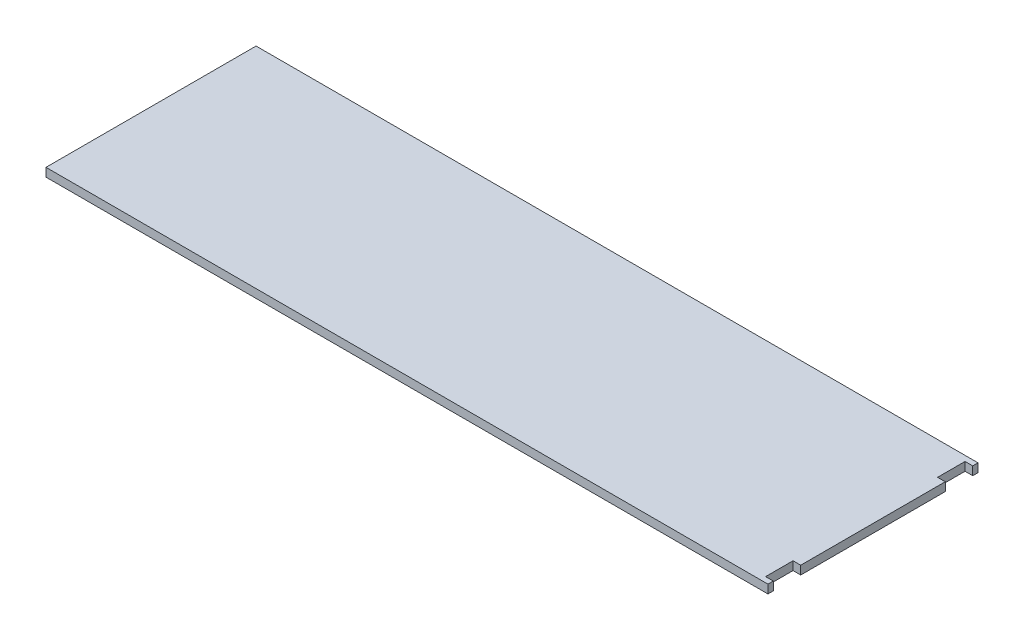
ISO-10303-21;
HEADER;
FILE_DESCRIPTION(('STEP AP214'),'2;1');
FILE_NAME('part.step','',(''),(''),'','','');
FILE_SCHEMA(('AUTOMOTIVE_DESIGN { 1 0 10303 214 1 1 1 1 }'));
ENDSEC;
DATA;
#1=APPLICATION_CONTEXT('core data for automotive mechanical design processes');
#2=APPLICATION_PROTOCOL_DEFINITION('international standard','automotive_design',2000,#1);
#3=PRODUCT_CONTEXT('',#1,'mechanical');
#4=PRODUCT('Part','Part','',(#3));
#5=PRODUCT_RELATED_PRODUCT_CATEGORY('part','',(#4));
#6=PRODUCT_DEFINITION_FORMATION('','',#4);
#7=PRODUCT_DEFINITION_CONTEXT('part definition',#1,'design');
#8=PRODUCT_DEFINITION('design','',#6,#7);
#9=PRODUCT_DEFINITION_SHAPE('','',#8);
#10=(LENGTH_UNIT() NAMED_UNIT(*) SI_UNIT(.MILLI.,.METRE.));
#11=(NAMED_UNIT(*) PLANE_ANGLE_UNIT() SI_UNIT($,.RADIAN.));
#12=(NAMED_UNIT(*) SI_UNIT($,.STERADIAN.) SOLID_ANGLE_UNIT());
#13=UNCERTAINTY_MEASURE_WITH_UNIT(LENGTH_MEASURE(1.E-05),#10,'distance_accuracy_value','');
#14=(GEOMETRIC_REPRESENTATION_CONTEXT(3) GLOBAL_UNCERTAINTY_ASSIGNED_CONTEXT((#13)) GLOBAL_UNIT_ASSIGNED_CONTEXT((#10,
#11,#12)) REPRESENTATION_CONTEXT('',''));
#15=CARTESIAN_POINT('',(0.,0.,0.));
#16=DIRECTION('',(0.,0.,1.));
#17=DIRECTION('',(1.,0.,0.));
#18=AXIS2_PLACEMENT_3D('',#15,#16,#17);
#19=CARTESIAN_POINT('',(1002.64387078607,12.7,-291.398750215943));
#20=DIRECTION('',(-1.,0.,0.));
#21=DIRECTION('',(0.,0.,1.));
#22=AXIS2_PLACEMENT_3D('',#19,#20,#21);
#23=PLANE('',#22);
#24=DIRECTION('',(0.,1.,0.));
#25=VECTOR('',#24,1.);
#26=CARTESIAN_POINT('',(1002.64387078607,0.,-27.4927502159425));
#27=LINE('',#26,#25);
#28=CARTESIAN_POINT('',(1002.64387078607,0.,-27.4927502159425));
#29=VERTEX_POINT('',#28);
#30=CARTESIAN_POINT('',(1002.64387078607,12.7,-27.4927502159425));
#31=VERTEX_POINT('',#30);
#32=EDGE_CURVE('E154',#29,#31,#27,.T.);
#33=ORIENTED_EDGE('',*,*,#32,.F.);
#34=DIRECTION('',(0.,0.,-1.));
#35=VECTOR('',#34,1.);
#36=CARTESIAN_POINT('',(1002.64387078607,0.,-291.398750215943));
#37=LINE('',#36,#35);
#38=CARTESIAN_POINT('',(1002.64387078607,0.,-242.656150215943));
#39=VERTEX_POINT('',#38);
#40=EDGE_CURVE('E203',#29,#39,#37,.T.);
#41=ORIENTED_EDGE('',*,*,#40,.T.);
#42=DIRECTION('',(0.,1.,0.));
#43=VECTOR('',#42,1.);
#44=CARTESIAN_POINT('',(1002.64387078607,0.,-242.656150215943));
#45=LINE('',#44,#43);
#46=CARTESIAN_POINT('',(1002.64387078607,12.7,-242.656150215943));
#47=VERTEX_POINT('',#46);
#48=EDGE_CURVE('E173',#39,#47,#45,.T.);
#49=ORIENTED_EDGE('',*,*,#48,.T.);
#50=DIRECTION('',(0.,0.,-1.));
#51=VECTOR('',#50,1.);
#52=CARTESIAN_POINT('',(1002.64387078607,12.7,-291.398750215943));
#53=LINE('',#52,#51);
#54=EDGE_CURVE('E193',#31,#47,#53,.T.);
#55=ORIENTED_EDGE('',*,*,#54,.F.);
#56=EDGE_LOOP('',(#33,#41,#49,#55));
#57=FACE_BOUND('',#56,.T.);
#58=ADVANCED_FACE('F33',(#57),#23,.F.);
#59=CARTESIAN_POINT('',(-72.0936292139341,12.7,21.3387497840574));
#60=DIRECTION('',(0.,1.,0.));
#61=DIRECTION('',(0.,0.,1.));
#62=AXIS2_PLACEMENT_3D('',#59,#60,#61);
#63=PLANE('',#62);
#64=DIRECTION('',(0.,0.,-1.));
#65=VECTOR('',#64,1.);
#66=CARTESIAN_POINT('',(991.213870786066,12.7,-135.030000215943));
#67=LINE('',#66,#65);
#68=CARTESIAN_POINT('',(991.213870786066,12.7,13.4012497840574));
#69=VERTEX_POINT('',#68);
#70=CARTESIAN_POINT('',(991.213870786065,12.7,-27.4927502159425));
#71=VERTEX_POINT('',#70);
#72=EDGE_CURVE('E129',#69,#71,#67,.T.);
#73=ORIENTED_EDGE('',*,*,#72,.T.);
#74=DIRECTION('',(1.,0.,0.));
#75=VECTOR('',#74,1.);
#76=CARTESIAN_POINT('',(-405.488830646532,12.7,-27.4927502159425));
#77=LINE('',#76,#75);
#78=EDGE_CURVE('E142',#71,#31,#77,.T.);
#79=ORIENTED_EDGE('',*,*,#78,.T.);
#80=ORIENTED_EDGE('',*,*,#54,.T.);
#81=DIRECTION('',(1.,0.,0.));
#82=VECTOR('',#81,1.);
#83=CARTESIAN_POINT('',(-405.488830646531,12.7,-242.65615021595));
#84=LINE('',#83,#82);
#85=CARTESIAN_POINT('',(991.213870786066,12.7,-242.656150215943));
#86=VERTEX_POINT('',#85);
#87=EDGE_CURVE('E160',#86,#47,#84,.T.);
#88=ORIENTED_EDGE('',*,*,#87,.F.);
#89=DIRECTION('',(0.,0.,1.));
#90=VECTOR('',#89,1.);
#91=CARTESIAN_POINT('',(991.213870786066,12.7,-135.030000215943));
#92=LINE('',#91,#90);
#93=CARTESIAN_POINT('',(991.213870786066,12.7,-283.550150215943));
#94=VERTEX_POINT('',#93);
#95=EDGE_CURVE('E168',#94,#86,#92,.T.);
#96=ORIENTED_EDGE('',*,*,#95,.F.);
#97=DIRECTION('',(-1.,0.,0.));
#98=VECTOR('',#97,1.);
#99=CARTESIAN_POINT('',(-405.488830646531,12.7,-283.55015021595));
#100=LINE('',#99,#98);
#101=CARTESIAN_POINT('',(1002.64387078607,12.7,-283.550150215943));
#102=VERTEX_POINT('',#101);
#103=EDGE_CURVE('E153',#102,#94,#100,.T.);
#104=ORIENTED_EDGE('',*,*,#103,.F.);
#105=CARTESIAN_POINT('',(1002.64387078607,12.7,-291.398750215943));
#106=VERTEX_POINT('',#105);
#107=EDGE_CURVE('E188',#102,#106,#53,.T.);
#108=ORIENTED_EDGE('',*,*,#107,.T.);
#109=DIRECTION('',(-1.,0.,0.));
#110=VECTOR('',#109,1.);
#111=CARTESIAN_POINT('',(-72.0936292139342,12.7,-291.398750215943));
#112=LINE('',#111,#110);
#113=CARTESIAN_POINT('',(-72.0936292139342,12.7,-291.398750215943));
#114=VERTEX_POINT('',#113);
#115=EDGE_CURVE('E192',#106,#114,#112,.T.);
#116=ORIENTED_EDGE('',*,*,#115,.T.);
#117=DIRECTION('',(0.,0.,1.));
#118=VECTOR('',#117,1.);
#119=CARTESIAN_POINT('',(-72.0936292139342,12.7,-291.398750215943));
#120=LINE('',#119,#118);
#121=CARTESIAN_POINT('',(-72.0936292139341,12.7,21.3387497840574));
#122=VERTEX_POINT('',#121);
#123=EDGE_CURVE('E182',#114,#122,#120,.T.);
#124=ORIENTED_EDGE('',*,*,#123,.T.);
#125=DIRECTION('',(1.,0.,0.));
#126=VECTOR('',#125,1.);
#127=CARTESIAN_POINT('',(-72.0936292139341,12.7,21.3387497840574));
#128=LINE('',#127,#126);
#129=CARTESIAN_POINT('',(1002.64387078607,12.7,21.3387497840574));
#130=VERTEX_POINT('',#129);
#131=EDGE_CURVE('E185',#122,#130,#128,.T.);
#132=ORIENTED_EDGE('',*,*,#131,.T.);
#133=CARTESIAN_POINT('',(1002.64387078607,12.7,13.4012497840574));
#134=VERTEX_POINT('',#133);
#135=EDGE_CURVE('E189',#130,#134,#53,.T.);
#136=ORIENTED_EDGE('',*,*,#135,.T.);
#137=DIRECTION('',(1.,0.,0.));
#138=VECTOR('',#137,1.);
#139=CARTESIAN_POINT('',(-405.488830646532,12.7,13.4012497840574));
#140=LINE('',#139,#138);
#141=EDGE_CURVE('E145',#69,#134,#140,.T.);
#142=ORIENTED_EDGE('',*,*,#141,.F.);
#143=EDGE_LOOP('',(#73,#79,#80,#88,#96,#104,#108,#116,#124,#132,#136,#142));
#144=FACE_BOUND('',#143,.T.);
#145=ADVANCED_FACE('F239',(#144),#63,.T.);
#146=CARTESIAN_POINT('',(-72.0936292139341,0.,21.3387497840574));
#147=DIRECTION('',(0.,1.,0.));
#148=DIRECTION('',(0.,0.,1.));
#149=AXIS2_PLACEMENT_3D('',#146,#147,#148);
#150=PLANE('',#149);
#151=DIRECTION('',(1.,0.,0.));
#152=VECTOR('',#151,1.);
#153=CARTESIAN_POINT('',(-405.488830646532,0.,-27.4927502159425));
#154=LINE('',#153,#152);
#155=CARTESIAN_POINT('',(991.213870786065,0.,-27.4927502159425));
#156=VERTEX_POINT('',#155);
#157=EDGE_CURVE('E131',#156,#29,#154,.T.);
#158=ORIENTED_EDGE('',*,*,#157,.F.);
#159=DIRECTION('',(0.,0.,-1.));
#160=VECTOR('',#159,1.);
#161=CARTESIAN_POINT('',(991.213870786066,0.,-135.030000215943));
#162=LINE('',#161,#160);
#163=CARTESIAN_POINT('',(991.213870786066,0.,13.4012497840574));
#164=VERTEX_POINT('',#163);
#165=EDGE_CURVE('E126',#164,#156,#162,.T.);
#166=ORIENTED_EDGE('',*,*,#165,.F.);
#167=DIRECTION('',(1.,0.,0.));
#168=VECTOR('',#167,1.);
#169=CARTESIAN_POINT('',(-405.488830646532,0.,13.4012497840574));
#170=LINE('',#169,#168);
#171=CARTESIAN_POINT('',(1002.64387078607,0.,13.4012497840573));
#172=VERTEX_POINT('',#171);
#173=EDGE_CURVE('E133',#164,#172,#170,.T.);
#174=ORIENTED_EDGE('',*,*,#173,.T.);
#175=CARTESIAN_POINT('',(1002.64387078607,0.,21.3387497840574));
#176=VERTEX_POINT('',#175);
#177=EDGE_CURVE('E201',#176,#172,#37,.T.);
#178=ORIENTED_EDGE('',*,*,#177,.F.);
#179=DIRECTION('',(1.,0.,0.));
#180=VECTOR('',#179,1.);
#181=CARTESIAN_POINT('',(-72.0936292139341,0.,21.3387497840574));
#182=LINE('',#181,#180);
#183=CARTESIAN_POINT('',(-72.0936292139341,0.,21.3387497840574));
#184=VERTEX_POINT('',#183);
#185=EDGE_CURVE('E198',#184,#176,#182,.T.);
#186=ORIENTED_EDGE('',*,*,#185,.F.);
#187=DIRECTION('',(0.,0.,1.));
#188=VECTOR('',#187,1.);
#189=CARTESIAN_POINT('',(-72.0936292139342,0.,-291.398750215943));
#190=LINE('',#189,#188);
#191=CARTESIAN_POINT('',(-72.0936292139342,0.,-291.398750215943));
#192=VERTEX_POINT('',#191);
#193=EDGE_CURVE('E176',#192,#184,#190,.T.);
#194=ORIENTED_EDGE('',*,*,#193,.F.);
#195=DIRECTION('',(-1.,0.,0.));
#196=VECTOR('',#195,1.);
#197=CARTESIAN_POINT('',(-72.0936292139342,0.,-291.398750215943));
#198=LINE('',#197,#196);
#199=CARTESIAN_POINT('',(1002.64387078607,0.,-291.398750215943));
#200=VERTEX_POINT('',#199);
#201=EDGE_CURVE('E186',#200,#192,#198,.T.);
#202=ORIENTED_EDGE('',*,*,#201,.F.);
#203=CARTESIAN_POINT('',(1002.64387078607,0.,-283.550150215943));
#204=VERTEX_POINT('',#203);
#205=EDGE_CURVE('E200',#204,#200,#37,.T.);
#206=ORIENTED_EDGE('',*,*,#205,.F.);
#207=DIRECTION('',(-1.,0.,0.));
#208=VECTOR('',#207,1.);
#209=CARTESIAN_POINT('',(-405.488830646531,0.,-283.55015021595));
#210=LINE('',#209,#208);
#211=CARTESIAN_POINT('',(991.213870786065,0.,-283.550150215943));
#212=VERTEX_POINT('',#211);
#213=EDGE_CURVE('E157',#204,#212,#210,.T.);
#214=ORIENTED_EDGE('',*,*,#213,.T.);
#215=DIRECTION('',(0.,0.,1.));
#216=VECTOR('',#215,1.);
#217=CARTESIAN_POINT('',(991.213870786066,0.,-135.030000215943));
#218=LINE('',#217,#216);
#219=CARTESIAN_POINT('',(991.213870786066,0.,-242.656150215943));
#220=VERTEX_POINT('',#219);
#221=EDGE_CURVE('E56',#212,#220,#218,.T.);
#222=ORIENTED_EDGE('',*,*,#221,.T.);
#223=DIRECTION('',(1.,0.,0.));
#224=VECTOR('',#223,1.);
#225=CARTESIAN_POINT('',(-405.488830646531,0.,-242.65615021595));
#226=LINE('',#225,#224);
#227=EDGE_CURVE('E162',#220,#39,#226,.T.);
#228=ORIENTED_EDGE('',*,*,#227,.T.);
#229=ORIENTED_EDGE('',*,*,#40,.F.);
#230=EDGE_LOOP('',(#158,#166,#174,#178,#186,#194,#202,#206,#214,#222,#228,#229));
#231=FACE_BOUND('',#230,.T.);
#232=ADVANCED_FACE('F140',(#231),#150,.F.);
#233=ORIENTED_EDGE('',*,*,#177,.T.);
#234=DIRECTION('',(0.,1.,0.));
#235=VECTOR('',#234,1.);
#236=CARTESIAN_POINT('',(1002.64387078607,0.,13.4012497840574));
#237=LINE('',#236,#235);
#238=EDGE_CURVE('E48',#172,#134,#237,.T.);
#239=ORIENTED_EDGE('',*,*,#238,.T.);
#240=ORIENTED_EDGE('',*,*,#135,.F.);
#241=DIRECTION('',(0.,-1.,0.));
#242=VECTOR('',#241,1.);
#243=CARTESIAN_POINT('',(1002.64387078607,12.7,21.3387497840574));
#244=LINE('',#243,#242);
#245=EDGE_CURVE('E41',#130,#176,#244,.T.);
#246=ORIENTED_EDGE('',*,*,#245,.T.);
#247=EDGE_LOOP('',(#233,#239,#240,#246));
#248=FACE_BOUND('',#247,.T.);
#249=ADVANCED_FACE('F213',(#248),#23,.F.);
#250=CARTESIAN_POINT('',(-72.0936292139342,12.7,-291.398750215943));
#251=DIRECTION('',(1.,0.,0.));
#252=DIRECTION('',(0.,0.,-1.));
#253=AXIS2_PLACEMENT_3D('',#250,#251,#252);
#254=PLANE('',#253);
#255=ORIENTED_EDGE('',*,*,#193,.T.);
#256=DIRECTION('',(0.,-1.,0.));
#257=VECTOR('',#256,1.);
#258=CARTESIAN_POINT('',(-72.0936292139341,12.7,21.3387497840574));
#259=LINE('',#258,#257);
#260=EDGE_CURVE('E11',#122,#184,#259,.T.);
#261=ORIENTED_EDGE('',*,*,#260,.F.);
#262=ORIENTED_EDGE('',*,*,#123,.F.);
#263=DIRECTION('',(0.,-1.,0.));
#264=VECTOR('',#263,1.);
#265=CARTESIAN_POINT('',(-72.0936292139342,12.7,-291.398750215943));
#266=LINE('',#265,#264);
#267=EDGE_CURVE('E195',#114,#192,#266,.T.);
#268=ORIENTED_EDGE('',*,*,#267,.T.);
#269=EDGE_LOOP('',(#255,#261,#262,#268));
#270=FACE_BOUND('',#269,.T.);
#271=ADVANCED_FACE('F35',(#270),#254,.F.);
#272=CARTESIAN_POINT('',(-72.0936292139341,12.7,21.3387497840574));
#273=DIRECTION('',(0.,0.,-1.));
#274=DIRECTION('',(-1.,0.,0.));
#275=AXIS2_PLACEMENT_3D('',#272,#273,#274);
#276=PLANE('',#275);
#277=ORIENTED_EDGE('',*,*,#185,.T.);
#278=ORIENTED_EDGE('',*,*,#245,.F.);
#279=ORIENTED_EDGE('',*,*,#131,.F.);
#280=ORIENTED_EDGE('',*,*,#260,.T.);
#281=EDGE_LOOP('',(#277,#278,#279,#280));
#282=FACE_BOUND('',#281,.T.);
#283=ADVANCED_FACE('F218',(#282),#276,.F.);
#284=ORIENTED_EDGE('',*,*,#107,.F.);
#285=DIRECTION('',(0.,1.,0.));
#286=VECTOR('',#285,1.);
#287=CARTESIAN_POINT('',(1002.64387078607,0.,-283.550150215943));
#288=LINE('',#287,#286);
#289=EDGE_CURVE('E165',#204,#102,#288,.T.);
#290=ORIENTED_EDGE('',*,*,#289,.F.);
#291=ORIENTED_EDGE('',*,*,#205,.T.);
#292=DIRECTION('',(0.,-1.,0.));
#293=VECTOR('',#292,1.);
#294=CARTESIAN_POINT('',(1002.64387078607,12.7,-291.398750215943));
#295=LINE('',#294,#293);
#296=EDGE_CURVE('E207',#106,#200,#295,.T.);
#297=ORIENTED_EDGE('',*,*,#296,.F.);
#298=EDGE_LOOP('',(#284,#290,#291,#297));
#299=FACE_BOUND('',#298,.T.);
#300=ADVANCED_FACE('F242',(#299),#23,.F.);
#301=CARTESIAN_POINT('',(-72.0936292139342,12.7,-291.398750215943));
#302=DIRECTION('',(0.,0.,1.));
#303=DIRECTION('',(1.,0.,0.));
#304=AXIS2_PLACEMENT_3D('',#301,#302,#303);
#305=PLANE('',#304);
#306=ORIENTED_EDGE('',*,*,#201,.T.);
#307=ORIENTED_EDGE('',*,*,#267,.F.);
#308=ORIENTED_EDGE('',*,*,#115,.F.);
#309=ORIENTED_EDGE('',*,*,#296,.T.);
#310=EDGE_LOOP('',(#306,#307,#308,#309));
#311=FACE_BOUND('',#310,.T.);
#312=ADVANCED_FACE('F224',(#311),#305,.F.);
#313=CARTESIAN_POINT('',(-405.488830646531,0.,-242.65615021595));
#314=DIRECTION('',(0.,0.,1.));
#315=DIRECTION('',(1.,0.,0.));
#316=AXIS2_PLACEMENT_3D('',#313,#314,#315);
#317=PLANE('',#316);
#318=ORIENTED_EDGE('',*,*,#87,.T.);
#319=ORIENTED_EDGE('',*,*,#48,.F.);
#320=ORIENTED_EDGE('',*,*,#227,.F.);
#321=DIRECTION('',(0.,1.,0.));
#322=VECTOR('',#321,1.);
#323=CARTESIAN_POINT('',(991.213870786066,0.,-242.656150215943));
#324=LINE('',#323,#322);
#325=EDGE_CURVE('E177',#220,#86,#324,.T.);
#326=ORIENTED_EDGE('',*,*,#325,.T.);
#327=EDGE_LOOP('',(#318,#319,#320,#326));
#328=FACE_BOUND('',#327,.T.);
#329=ADVANCED_FACE('F235',(#328),#317,.F.);
#330=CARTESIAN_POINT('',(991.213870786066,0.,-135.030000215943));
#331=DIRECTION('',(-1.,0.,0.));
#332=DIRECTION('',(0.,0.,1.));
#333=AXIS2_PLACEMENT_3D('',#330,#331,#332);
#334=PLANE('',#333);
#335=ORIENTED_EDGE('',*,*,#95,.T.);
#336=ORIENTED_EDGE('',*,*,#325,.F.);
#337=ORIENTED_EDGE('',*,*,#221,.F.);
#338=DIRECTION('',(0.,1.,0.));
#339=VECTOR('',#338,1.);
#340=CARTESIAN_POINT('',(991.213870786066,0.,-283.550150215943));
#341=LINE('',#340,#339);
#342=EDGE_CURVE('E179',#212,#94,#341,.T.);
#343=ORIENTED_EDGE('',*,*,#342,.T.);
#344=EDGE_LOOP('',(#335,#336,#337,#343));
#345=FACE_BOUND('',#344,.T.);
#346=ADVANCED_FACE('F265',(#345),#334,.F.);
#347=CARTESIAN_POINT('',(-405.488830646531,0.,-283.55015021595));
#348=DIRECTION('',(0.,0.,-1.));
#349=DIRECTION('',(-1.,0.,0.));
#350=AXIS2_PLACEMENT_3D('',#347,#348,#349);
#351=PLANE('',#350);
#352=ORIENTED_EDGE('',*,*,#103,.T.);
#353=ORIENTED_EDGE('',*,*,#342,.F.);
#354=ORIENTED_EDGE('',*,*,#213,.F.);
#355=ORIENTED_EDGE('',*,*,#289,.T.);
#356=EDGE_LOOP('',(#352,#353,#354,#355));
#357=FACE_BOUND('',#356,.T.);
#358=ADVANCED_FACE('F262',(#357),#351,.F.);
#359=CARTESIAN_POINT('',(991.213870786066,0.,-135.030000215943));
#360=DIRECTION('',(1.,0.,0.));
#361=DIRECTION('',(0.,0.,-1.));
#362=AXIS2_PLACEMENT_3D('',#359,#360,#361);
#363=PLANE('',#362);
#364=ORIENTED_EDGE('',*,*,#72,.F.);
#365=DIRECTION('',(0.,1.,0.));
#366=VECTOR('',#365,1.);
#367=CARTESIAN_POINT('',(991.213870786066,0.,13.4012497840574));
#368=LINE('',#367,#366);
#369=EDGE_CURVE('E122',#164,#69,#368,.T.);
#370=ORIENTED_EDGE('',*,*,#369,.F.);
#371=ORIENTED_EDGE('',*,*,#165,.T.);
#372=DIRECTION('',(0.,1.,0.));
#373=VECTOR('',#372,1.);
#374=CARTESIAN_POINT('',(991.213870786065,0.,-27.4927502159425));
#375=LINE('',#374,#373);
#376=EDGE_CURVE('E151',#156,#71,#375,.T.);
#377=ORIENTED_EDGE('',*,*,#376,.T.);
#378=EDGE_LOOP('',(#364,#370,#371,#377));
#379=FACE_BOUND('',#378,.T.);
#380=ADVANCED_FACE('F123',(#379),#363,.T.);
#381=CARTESIAN_POINT('',(-405.488830646532,0.,-27.4927502159425));
#382=DIRECTION('',(0.,0.,1.));
#383=DIRECTION('',(1.,0.,0.));
#384=AXIS2_PLACEMENT_3D('',#381,#382,#383);
#385=PLANE('',#384);
#386=ORIENTED_EDGE('',*,*,#78,.F.);
#387=ORIENTED_EDGE('',*,*,#376,.F.);
#388=ORIENTED_EDGE('',*,*,#157,.T.);
#389=ORIENTED_EDGE('',*,*,#32,.T.);
#390=EDGE_LOOP('',(#386,#387,#388,#389));
#391=FACE_BOUND('',#390,.T.);
#392=ADVANCED_FACE('F273',(#391),#385,.T.);
#393=CARTESIAN_POINT('',(-405.488830646532,0.,13.4012497840574));
#394=DIRECTION('',(0.,0.,1.));
#395=DIRECTION('',(1.,0.,0.));
#396=AXIS2_PLACEMENT_3D('',#393,#394,#395);
#397=PLANE('',#396);
#398=ORIENTED_EDGE('',*,*,#141,.T.);
#399=ORIENTED_EDGE('',*,*,#238,.F.);
#400=ORIENTED_EDGE('',*,*,#173,.F.);
#401=ORIENTED_EDGE('',*,*,#369,.T.);
#402=EDGE_LOOP('',(#398,#399,#400,#401));
#403=FACE_BOUND('',#402,.T.);
#404=ADVANCED_FACE('F134',(#403),#397,.F.);
#405=CLOSED_SHELL('',(#58,#145,#232,#249,#271,#283,#300,#312,#329,#346,#358,#380,#392,#404));
#406=MANIFOLD_SOLID_BREP('B2',#405);
#407=ADVANCED_BREP_SHAPE_REPRESENTATION('',(#18,#406),#14);
#408=SHAPE_DEFINITION_REPRESENTATION(#9,#407);
ENDSEC;
END-ISO-10303-21;
